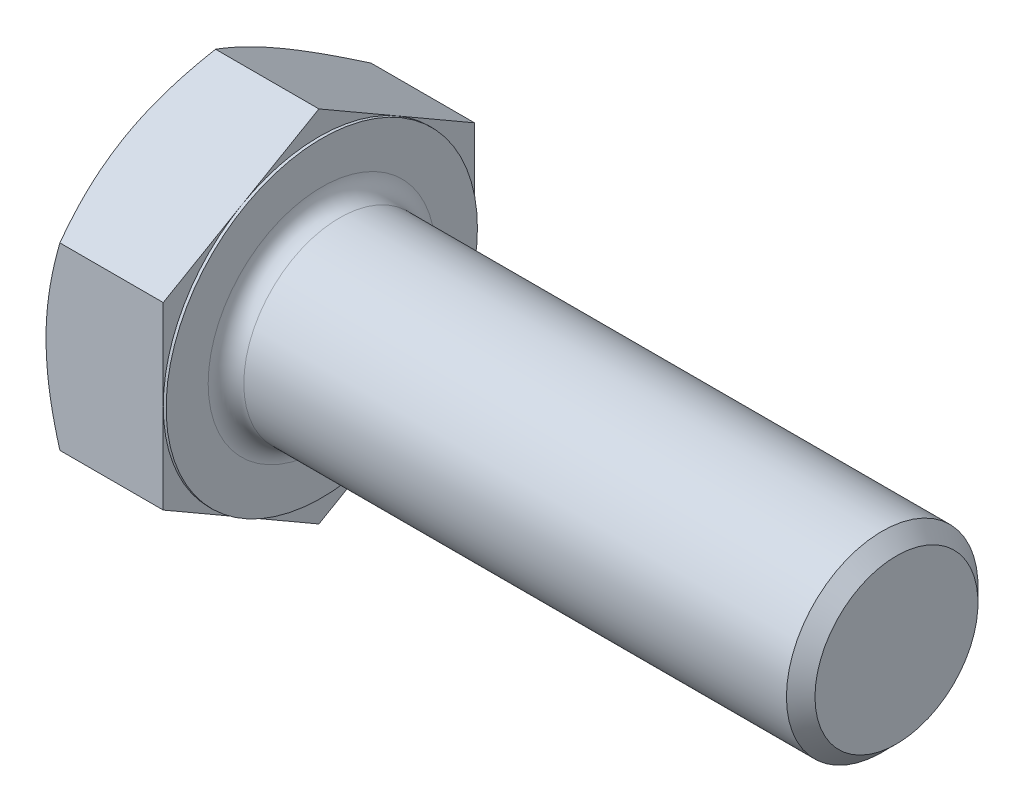
ISO-10303-21;
HEADER;
FILE_DESCRIPTION(('STEP AP214'),'2;1');
FILE_NAME('part.step','',(''),(''),'','','');
FILE_SCHEMA(('AUTOMOTIVE_DESIGN { 1 0 10303 214 1 1 1 1 }'));
ENDSEC;
DATA;
#1=APPLICATION_CONTEXT('core data for automotive mechanical design processes');
#2=APPLICATION_PROTOCOL_DEFINITION('international standard','automotive_design',2000,#1);
#3=PRODUCT_CONTEXT('',#1,'mechanical');
#4=PRODUCT('Part','Part','',(#3));
#5=PRODUCT_RELATED_PRODUCT_CATEGORY('part','',(#4));
#6=PRODUCT_DEFINITION_FORMATION('','',#4);
#7=PRODUCT_DEFINITION_CONTEXT('part definition',#1,'design');
#8=PRODUCT_DEFINITION('design','',#6,#7);
#9=PRODUCT_DEFINITION_SHAPE('','',#8);
#10=(LENGTH_UNIT() NAMED_UNIT(*) SI_UNIT(.MILLI.,.METRE.));
#11=(NAMED_UNIT(*) PLANE_ANGLE_UNIT() SI_UNIT($,.RADIAN.));
#12=(NAMED_UNIT(*) SI_UNIT($,.STERADIAN.) SOLID_ANGLE_UNIT());
#13=UNCERTAINTY_MEASURE_WITH_UNIT(LENGTH_MEASURE(1.E-05),#10,'distance_accuracy_value','');
#14=(GEOMETRIC_REPRESENTATION_CONTEXT(3) GLOBAL_UNCERTAINTY_ASSIGNED_CONTEXT((#13)) GLOBAL_UNIT_ASSIGNED_CONTEXT((#10,
#11,#12)) REPRESENTATION_CONTEXT('',''));
#15=CARTESIAN_POINT('',(0.,0.,0.));
#16=DIRECTION('',(0.,0.,1.));
#17=DIRECTION('',(1.,0.,0.));
#18=AXIS2_PLACEMENT_3D('',#15,#16,#17);
#19=CARTESIAN_POINT('',(15.9258,23.8301323608018,0.));
#20=DIRECTION('',(1.,0.,0.));
#21=DIRECTION('',(0.,0.,-1.));
#22=AXIS2_PLACEMENT_3D('',#19,#20,#21);
#23=PLANE('',#22);
#24=CARTESIAN_POINT('',(15.9258,0.,0.));
#25=DIRECTION('',(1.,0.,0.));
#26=DIRECTION('',(0.,0.,-1.));
#27=AXIS2_PLACEMENT_3D('',#24,#25,#26);
#28=CIRCLE('',#27,15.0622);
#29=CARTESIAN_POINT('',(15.9258,0.,-15.0622));
#30=VERTEX_POINT('',#29);
#31=EDGE_CURVE('E40',#30,#30,#28,.F.);
#32=ORIENTED_EDGE('',*,*,#31,.T.);
#33=EDGE_LOOP('',(#32));
#34=FACE_BOUND('',#33,.T.);
#35=CARTESIAN_POINT('',(15.9258,0.,0.));
#36=DIRECTION('',(1.,0.,0.));
#37=DIRECTION('',(0.,0.,-1.));
#38=AXIS2_PLACEMENT_3D('',#35,#36,#37);
#39=CIRCLE('',#38,20.6375);
#40=CARTESIAN_POINT('',(15.9258,0.,-20.6375));
#41=VERTEX_POINT('',#40);
#42=EDGE_CURVE('E291',#41,#41,#39,.T.);
#43=ORIENTED_EDGE('',*,*,#42,.T.);
#44=EDGE_LOOP('',(#43));
#45=FACE_BOUND('',#44,.T.);
#46=ADVANCED_FACE('F32',(#34,#45),#23,.T.);
#47=CARTESIAN_POINT('',(0.,0.,0.));
#48=DIRECTION('',(-1.,0.,0.));
#49=DIRECTION('',(0.,0.,1.));
#50=AXIS2_PLACEMENT_3D('',#47,#48,#49);
#51=CYLINDRICAL_SURFACE('',#50,12.7);
#52=CARTESIAN_POINT('',(18.288,0.,0.));
#53=DIRECTION('',(1.,0.,0.));
#54=DIRECTION('',(0.,0.,-1.));
#55=AXIS2_PLACEMENT_3D('',#52,#53,#54);
#56=CIRCLE('',#55,12.7);
#57=CARTESIAN_POINT('',(18.288,0.,-12.7));
#58=VERTEX_POINT('',#57);
#59=EDGE_CURVE('E11',#58,#58,#56,.T.);
#60=ORIENTED_EDGE('',*,*,#59,.T.);
#61=EDGE_LOOP('',(#60));
#62=FACE_BOUND('',#61,.T.);
#63=CARTESIAN_POINT('',(90.2335,0.,0.));
#64=DIRECTION('',(-1.,0.,0.));
#65=DIRECTION('',(0.,0.,1.));
#66=AXIS2_PLACEMENT_3D('',#63,#64,#65);
#67=CIRCLE('',#66,12.7);
#68=CARTESIAN_POINT('',(90.2335,0.,12.7));
#69=VERTEX_POINT('',#68);
#70=EDGE_CURVE('E270',#69,#69,#67,.T.);
#71=ORIENTED_EDGE('',*,*,#70,.T.);
#72=EDGE_LOOP('',(#71));
#73=FACE_BOUND('',#72,.T.);
#74=ADVANCED_FACE('F244',(#62,#73),#51,.T.);
#75=CARTESIAN_POINT('',(92.1258,0.,0.));
#76=DIRECTION('',(-1.,0.,0.));
#77=DIRECTION('',(0.,0.,1.));
#78=AXIS2_PLACEMENT_3D('',#75,#76,#77);
#79=CONICAL_SURFACE('',#78,10.8077,0.785398163397441);
#80=ORIENTED_EDGE('',*,*,#70,.F.);
#81=EDGE_LOOP('',(#80));
#82=FACE_BOUND('',#81,.T.);
#83=CARTESIAN_POINT('',(92.1258,0.,0.));
#84=DIRECTION('',(-1.,0.,0.));
#85=DIRECTION('',(0.,0.,1.));
#86=AXIS2_PLACEMENT_3D('',#83,#84,#85);
#87=CIRCLE('',#86,10.8077);
#88=CARTESIAN_POINT('',(92.1258,0.,10.8077));
#89=VERTEX_POINT('',#88);
#90=EDGE_CURVE('E268',#89,#89,#87,.T.);
#91=ORIENTED_EDGE('',*,*,#90,.T.);
#92=EDGE_LOOP('',(#91));
#93=FACE_BOUND('',#92,.T.);
#94=ADVANCED_FACE('F249',(#82,#93),#79,.T.);
#95=CARTESIAN_POINT('',(92.1258,0.,0.));
#96=DIRECTION('',(-1.,0.,0.));
#97=DIRECTION('',(0.,0.,1.));
#98=AXIS2_PLACEMENT_3D('',#95,#96,#97);
#99=PLANE('',#98);
#100=ORIENTED_EDGE('',*,*,#90,.F.);
#101=EDGE_LOOP('',(#100));
#102=FACE_BOUND('',#101,.T.);
#103=ADVANCED_FACE('F256',(#102),#99,.F.);
#104=CARTESIAN_POINT('',(15.5448,20.6375,0.));
#105=DIRECTION('',(1.,0.,0.));
#106=DIRECTION('',(0.,0.,-1.));
#107=AXIS2_PLACEMENT_3D('',#104,#105,#106);
#108=PLANE('',#107);
#109=DIRECTION('',(0.,0.500000000000001,0.866025403784438));
#110=VECTOR('',#109,1.);
#111=CARTESIAN_POINT('',(15.5448,11.9150661804009,-20.6375));
#112=LINE('',#111,#110);
#113=CARTESIAN_POINT('',(15.5448,11.9150661804009,-20.6375));
#114=VERTEX_POINT('',#113);
#115=CARTESIAN_POINT('',(15.5448,17.8725992706013,-10.31875));
#116=VERTEX_POINT('',#115);
#117=EDGE_CURVE('E164',#114,#116,#112,.T.);
#118=ORIENTED_EDGE('',*,*,#117,.T.);
#119=CARTESIAN_POINT('',(15.5448,0.,0.));
#120=DIRECTION('',(-1.,0.,0.));
#121=DIRECTION('',(0.,0.,1.));
#122=AXIS2_PLACEMENT_3D('',#119,#120,#121);
#123=CIRCLE('',#122,20.6375);
#124=CARTESIAN_POINT('',(15.5448,0.,-20.6375));
#125=VERTEX_POINT('',#124);
#126=EDGE_CURVE('E47',#116,#125,#123,.T.);
#127=ORIENTED_EDGE('',*,*,#126,.T.);
#128=DIRECTION('',(0.,1.,0.));
#129=VECTOR('',#128,1.);
#130=CARTESIAN_POINT('',(15.5448,11.9150661804009,-20.6375));
#131=LINE('',#130,#129);
#132=EDGE_CURVE('E294',#125,#114,#131,.T.);
#133=ORIENTED_EDGE('',*,*,#132,.T.);
#134=EDGE_LOOP('',(#118,#127,#133));
#135=FACE_BOUND('',#134,.T.);
#136=ADVANCED_FACE('F259',(#135),#108,.T.);
#137=CARTESIAN_POINT('',(15.5448,23.8301323608018,0.));
#138=VERTEX_POINT('',#137);
#139=EDGE_CURVE('E162',#116,#138,#112,.T.);
#140=ORIENTED_EDGE('',*,*,#139,.T.);
#141=DIRECTION('',(0.,-0.500000000000001,0.866025403784438));
#142=VECTOR('',#141,1.);
#143=CARTESIAN_POINT('',(15.5448,23.8301323608018,0.));
#144=LINE('',#143,#142);
#145=CARTESIAN_POINT('',(15.5448,17.8725992706013,10.31875));
#146=VERTEX_POINT('',#145);
#147=EDGE_CURVE('E161',#138,#146,#144,.T.);
#148=ORIENTED_EDGE('',*,*,#147,.T.);
#149=EDGE_CURVE('E150',#146,#116,#123,.T.);
#150=ORIENTED_EDGE('',*,*,#149,.T.);
#151=EDGE_LOOP('',(#140,#148,#150));
#152=FACE_BOUND('',#151,.T.);
#153=ADVANCED_FACE('F264',(#152),#108,.T.);
#154=CARTESIAN_POINT('',(15.5448,11.9150661804009,20.6375));
#155=VERTEX_POINT('',#154);
#156=EDGE_CURVE('E129',#146,#155,#144,.T.);
#157=ORIENTED_EDGE('',*,*,#156,.T.);
#158=DIRECTION('',(0.,-1.,0.));
#159=VECTOR('',#158,1.);
#160=CARTESIAN_POINT('',(15.5448,11.9150661804009,20.6375));
#161=LINE('',#160,#159);
#162=CARTESIAN_POINT('',(15.5448,0.,20.6375));
#163=VERTEX_POINT('',#162);
#164=EDGE_CURVE('E123',#155,#163,#161,.T.);
#165=ORIENTED_EDGE('',*,*,#164,.T.);
#166=EDGE_CURVE('E127',#163,#146,#123,.T.);
#167=ORIENTED_EDGE('',*,*,#166,.T.);
#168=EDGE_LOOP('',(#157,#165,#167));
#169=FACE_BOUND('',#168,.T.);
#170=ADVANCED_FACE('F125',(#169),#108,.T.);
#171=CARTESIAN_POINT('',(15.5448,-11.9150661804008,20.6375));
#172=VERTEX_POINT('',#171);
#173=EDGE_CURVE('E133',#163,#172,#161,.T.);
#174=ORIENTED_EDGE('',*,*,#173,.T.);
#175=DIRECTION('',(0.,-0.500000000000002,-0.866025403784438));
#176=VECTOR('',#175,1.);
#177=CARTESIAN_POINT('',(15.5448,-23.8301323608018,0.));
#178=LINE('',#177,#176);
#179=CARTESIAN_POINT('',(15.5448,-17.8725992706013,10.31875));
#180=VERTEX_POINT('',#179);
#181=EDGE_CURVE('E140',#172,#180,#178,.T.);
#182=ORIENTED_EDGE('',*,*,#181,.T.);
#183=EDGE_CURVE('E137',#180,#163,#123,.T.);
#184=ORIENTED_EDGE('',*,*,#183,.T.);
#185=EDGE_LOOP('',(#174,#182,#184));
#186=FACE_BOUND('',#185,.T.);
#187=ADVANCED_FACE('F138',(#186),#108,.T.);
#188=CARTESIAN_POINT('',(15.5448,-23.8301323608018,0.));
#189=VERTEX_POINT('',#188);
#190=EDGE_CURVE('E156',#180,#189,#178,.T.);
#191=ORIENTED_EDGE('',*,*,#190,.T.);
#192=DIRECTION('',(0.,0.499999999999999,-0.866025403784439));
#193=VECTOR('',#192,1.);
#194=CARTESIAN_POINT('',(15.5448,-11.9150661804009,-20.6375));
#195=LINE('',#194,#193);
#196=CARTESIAN_POINT('',(15.5448,-17.8725992706014,-10.31875));
#197=VERTEX_POINT('',#196);
#198=EDGE_CURVE('E332',#189,#197,#195,.T.);
#199=ORIENTED_EDGE('',*,*,#198,.T.);
#200=EDGE_CURVE('E144',#197,#180,#123,.T.);
#201=ORIENTED_EDGE('',*,*,#200,.T.);
#202=EDGE_LOOP('',(#191,#199,#201));
#203=FACE_BOUND('',#202,.T.);
#204=ADVANCED_FACE('F333',(#203),#108,.T.);
#205=CARTESIAN_POINT('',(15.5448,-11.9150661804009,-20.6375));
#206=VERTEX_POINT('',#205);
#207=EDGE_CURVE('E151',#197,#206,#195,.T.);
#208=ORIENTED_EDGE('',*,*,#207,.T.);
#209=EDGE_CURVE('E295',#206,#125,#131,.T.);
#210=ORIENTED_EDGE('',*,*,#209,.T.);
#211=EDGE_CURVE('E302',#125,#197,#123,.T.);
#212=ORIENTED_EDGE('',*,*,#211,.T.);
#213=EDGE_LOOP('',(#208,#210,#212));
#214=FACE_BOUND('',#213,.T.);
#215=ADVANCED_FACE('F265',(#214),#108,.T.);
#216=CARTESIAN_POINT('',(0.,0.,0.));
#217=DIRECTION('',(-1.,0.,0.));
#218=DIRECTION('',(0.,0.,1.));
#219=AXIS2_PLACEMENT_3D('',#216,#217,#218);
#220=CYLINDRICAL_SURFACE('',#219,20.6375);
#221=ORIENTED_EDGE('',*,*,#126,.F.);
#222=ORIENTED_EDGE('',*,*,#149,.F.);
#223=ORIENTED_EDGE('',*,*,#166,.F.);
#224=ORIENTED_EDGE('',*,*,#183,.F.);
#225=ORIENTED_EDGE('',*,*,#200,.F.);
#226=ORIENTED_EDGE('',*,*,#211,.F.);
#227=EDGE_LOOP('',(#221,#222,#223,#224,#225,#226));
#228=FACE_BOUND('',#227,.T.);
#229=ORIENTED_EDGE('',*,*,#42,.F.);
#230=EDGE_LOOP('',(#229));
#231=FACE_BOUND('',#230,.T.);
#232=ADVANCED_FACE('F147',(#228,#231),#220,.T.);
#233=CARTESIAN_POINT('',(0.,23.8301323608018,0.));
#234=DIRECTION('',(1.,0.,0.));
#235=DIRECTION('',(0.,0.,-1.));
#236=AXIS2_PLACEMENT_3D('',#233,#234,#235);
#237=PLANE('',#236);
#238=CARTESIAN_POINT('',(0.,0.,0.));
#239=DIRECTION('',(1.,0.,0.));
#240=DIRECTION('',(0.,0.,-1.));
#241=AXIS2_PLACEMENT_3D('',#238,#239,#240);
#242=CIRCLE('',#241,20.6375);
#243=CARTESIAN_POINT('',(0.,0.,-20.6375));
#244=VERTEX_POINT('',#243);
#245=CARTESIAN_POINT('',(0.,17.8725992706013,-10.31875));
#246=VERTEX_POINT('',#245);
#247=EDGE_CURVE('E290',#244,#246,#242,.T.);
#248=ORIENTED_EDGE('',*,*,#247,.F.);
#249=CARTESIAN_POINT('',(0.,-17.8725992706014,-10.31875));
#250=VERTEX_POINT('',#249);
#251=EDGE_CURVE('E286',#250,#244,#242,.T.);
#252=ORIENTED_EDGE('',*,*,#251,.F.);
#253=CARTESIAN_POINT('',(0.,-17.8725992706013,10.31875));
#254=VERTEX_POINT('',#253);
#255=EDGE_CURVE('E289',#254,#250,#242,.T.);
#256=ORIENTED_EDGE('',*,*,#255,.F.);
#257=CARTESIAN_POINT('',(0.,0.,20.6375));
#258=VERTEX_POINT('',#257);
#259=EDGE_CURVE('E325',#258,#254,#242,.T.);
#260=ORIENTED_EDGE('',*,*,#259,.F.);
#261=CARTESIAN_POINT('',(0.,0.,0.));
#262=DIRECTION('',(-1.,0.,0.));
#263=DIRECTION('',(0.,0.,1.));
#264=AXIS2_PLACEMENT_3D('',#261,#262,#263);
#265=CIRCLE('',#264,20.6375);
#266=CARTESIAN_POINT('',(0.,17.8725992706013,10.31875));
#267=VERTEX_POINT('',#266);
#268=EDGE_CURVE('E165',#258,#267,#265,.T.);
#269=ORIENTED_EDGE('',*,*,#268,.T.);
#270=EDGE_CURVE('E348',#246,#267,#242,.T.);
#271=ORIENTED_EDGE('',*,*,#270,.F.);
#272=EDGE_LOOP('',(#248,#252,#256,#260,#269,#271));
#273=FACE_BOUND('',#272,.T.);
#274=ADVANCED_FACE('F194',(#273),#237,.F.);
#275=CARTESIAN_POINT('',(0.,0.,0.));
#276=DIRECTION('',(1.,0.,0.));
#277=DIRECTION('',(0.,0.,-1.));
#278=AXIS2_PLACEMENT_3D('',#275,#276,#277);
#279=CONICAL_SURFACE('',#278,20.6375,1.0471975511966);
#280=CARTESIAN_POINT('',(1.84333382008364,11.914950710347,20.6377));
#281=CARTESIAN_POINT('',(1.69214337600419,12.1768388162799,20.1840964946264));
#282=CARTESIAN_POINT('',(1.54781374226857,12.4397484262674,19.7287236923298));
#283=CARTESIAN_POINT('',(1.27478315292442,12.9676758674181,18.814326541547));
#284=CARTESIAN_POINT('',(1.14608733754576,13.2326943616077,18.3553010446653));
#285=CARTESIAN_POINT('',(0.906054325478838,13.7653517625208,17.4327113632561));
#286=CARTESIAN_POINT('',(0.794758200785631,14.0329953304674,16.9691391052536));
#287=CARTESIAN_POINT('',(0.591914465835048,14.5701421920253,16.0387734499091));
#288=CARTESIAN_POINT('',(0.50036572457894,14.8396453782173,15.571980238623));
#289=CARTESIAN_POINT('',(0.340910585633043,15.3736059110997,14.6471334664341));
#290=CARTESIAN_POINT('',(0.272476417896142,15.6380236169871,14.1891485654163));
#291=CARTESIAN_POINT('',(0.157727822186074,16.1680706173259,13.27108023043));
#292=CARTESIAN_POINT('',(0.111413819990831,16.4336999349996,12.8109967562394));
#293=CARTESIAN_POINT('',(0.0420749613202055,16.9654047822575,11.890056946158));
#294=CARTESIAN_POINT('',(0.0190224305713767,17.2314794034924,11.4292021835745));
#295=CARTESIAN_POINT('',(-0.00329774541931306,17.7638741917795,10.5070673605763));
#296=CARTESIAN_POINT('',(-0.00256612562751956,18.03019435099,10.045787313744));
#297=CARTESIAN_POINT('',(0.0210208772954903,18.528085064253,9.18341530175577));
#298=CARTESIAN_POINT('',(0.0410000333968362,18.759691076882,8.78226192054387));
#299=CARTESIAN_POINT('',(0.0985671327331307,19.2223501741672,7.98091285746198));
#300=CARTESIAN_POINT('',(0.136154823768635,19.4534032666949,7.58071716195798));
#301=CARTESIAN_POINT('',(0.228287552877122,19.9148711564043,6.78143133091973));
#302=CARTESIAN_POINT('',(0.282847925177507,20.1452851855258,6.38234252570475));
#303=CARTESIAN_POINT('',(0.407960382025439,20.605009976384,5.58607583043941));
#304=CARTESIAN_POINT('',(0.478512398814658,20.8343207427911,5.18889793229961));
#305=CARTESIAN_POINT('',(0.71596653239891,21.530459444307,3.98315033215904));
#306=CARTESIAN_POINT('',(0.906558493433515,21.9953095159287,3.17800639020824));
#307=CARTESIAN_POINT('',(1.23103244120646,22.6874510236457,1.97918213281513));
#308=CARTESIAN_POINT('',(1.34550466252447,22.9171109250422,1.58139951513513));
#309=CARTESIAN_POINT('',(1.58603801996833,23.3748421953101,0.788585698818164));
#310=CARTESIAN_POINT('',(1.71209588971682,23.6029139925318,0.393553758256622));
#311=CARTESIAN_POINT('',(1.84333382008365,23.8302478308557,-0.000200000000002177));
#312=B_SPLINE_CURVE_WITH_KNOTS('',3,(#280,#281,#282,#283,#284,#285,#286,#287,#288,#289,#290,
#291,#292,#293,#294,#295,#296,#297,#298,#299,#300,#301,#302,#303,#304,#305,#306,#307,#308,#309,
#310,#311),.UNSPECIFIED.,.F.,.F.,(4,2,2,2,2,2,2,2,2,2,2,2,2,2,2,4),(0.,1.63552456713319,
3.27158542986609,4.91145173081582,6.55122408618254,8.1505234671481,9.74985363083664,
11.3472788131478,12.9446546326435,14.3352468669901,15.7258191850933,17.1176515036881,
18.5094779250488,21.3544387799186,22.7744411084872,24.1940443124036),.UNSPECIFIED.);
#313=CARTESIAN_POINT('',(1.84326715293243,23.8301323608018,0.));
#314=VERTEX_POINT('',#313);
#315=EDGE_CURVE('E213',#267,#314,#312,.T.);
#316=ORIENTED_EDGE('',*,*,#315,.T.);
#317=CARTESIAN_POINT('',(1.84333382008365,23.8302478308557,0.0002));
#318=CARTESIAN_POINT('',(1.69214337600421,23.5683597249228,-0.453403505373618));
#319=CARTESIAN_POINT('',(1.54781374226858,23.3054501149353,-0.908776307670228));
#320=CARTESIAN_POINT('',(1.27478315292444,22.7775226737846,-1.82317345845298));
#321=CARTESIAN_POINT('',(1.14608733754577,22.512504179595,-2.28219895533469));
#322=CARTESIAN_POINT('',(0.906054325478847,21.9798467786819,-3.20478863674389));
#323=CARTESIAN_POINT('',(0.79475820078564,21.7122032107353,-3.66836089474639));
#324=CARTESIAN_POINT('',(0.591914465835055,21.1750563491774,-4.59872655009088));
#325=CARTESIAN_POINT('',(0.500365724578947,20.9055531629854,-5.06551976137699));
#326=CARTESIAN_POINT('',(0.340910585633049,20.371592630103,-5.99036653356587));
#327=CARTESIAN_POINT('',(0.272476417896147,20.1071749242156,-6.44835143458366));
#328=CARTESIAN_POINT('',(0.157727822186078,19.5771279238768,-7.36641976956998));
#329=CARTESIAN_POINT('',(0.111413819990834,19.3114986062031,-7.82650324376062));
#330=CARTESIAN_POINT('',(0.0420749613202066,18.7797937589452,-8.74744305384203));
#331=CARTESIAN_POINT('',(0.019022430571377,18.5137191377103,-9.2082978164255));
#332=CARTESIAN_POINT('',(-0.00329774541931427,17.9813243494232,-10.1304326394237));
#333=CARTESIAN_POINT('',(-0.00256612562752133,17.7150041902127,-10.591712686256));
#334=CARTESIAN_POINT('',(0.0210208772954871,17.2171134769497,-11.4540846982442));
#335=CARTESIAN_POINT('',(0.0410000333968321,16.9855074643207,-11.8552380794561));
#336=CARTESIAN_POINT('',(0.0985671327331258,16.5228483670355,-12.656587142538));
#337=CARTESIAN_POINT('',(0.136154823768631,16.2917952745077,-13.056782838042));
#338=CARTESIAN_POINT('',(0.228287552877117,15.8303273847984,-13.8560686690803));
#339=CARTESIAN_POINT('',(0.282847925177502,15.5999133556769,-14.2551574742953));
#340=CARTESIAN_POINT('',(0.407960382025433,15.1401885648187,-15.0514241695606));
#341=CARTESIAN_POINT('',(0.478512398814649,14.9108777984116,-15.4486020677004));
#342=CARTESIAN_POINT('',(0.715966532398898,14.2147390968957,-16.654349667841));
#343=CARTESIAN_POINT('',(0.906558493433504,13.749889025274,-17.4594936097918));
#344=CARTESIAN_POINT('',(1.23103244120645,13.057747517557,-18.6583178671849));
#345=CARTESIAN_POINT('',(1.34550466252446,12.8280876161605,-19.0561004848649));
#346=CARTESIAN_POINT('',(1.58603801996831,12.3703563458926,-19.8489143011818));
#347=CARTESIAN_POINT('',(1.7120958897168,12.1422845486709,-20.2439462417434));
#348=CARTESIAN_POINT('',(1.84333382008363,11.914950710347,-20.6377));
#349=B_SPLINE_CURVE_WITH_KNOTS('',3,(#317,#318,#319,#320,#321,#322,#323,#324,#325,#326,#327,
#328,#329,#330,#331,#332,#333,#334,#335,#336,#337,#338,#339,#340,#341,#342,#343,#344,#345,#346,
#347,#348),.UNSPECIFIED.,.F.,.F.,(4,2,2,2,2,2,2,2,2,2,2,2,2,2,2,4),(0.,1.63552456713319,
3.27158542986609,4.91145173081583,6.55122408618254,8.1505234671481,9.74985363083665,
11.3472788131478,12.9446546326435,14.3352468669901,15.7258191850933,17.1176515036881,
18.5094779250488,21.3544387799186,22.7744411084872,24.1940443124036),.UNSPECIFIED.);
#350=EDGE_CURVE('E55',#314,#246,#349,.T.);
#351=ORIENTED_EDGE('',*,*,#350,.T.);
#352=ORIENTED_EDGE('',*,*,#270,.T.);
#353=EDGE_LOOP('',(#316,#351,#352));
#354=FACE_BOUND('',#353,.T.);
#355=ADVANCED_FACE('F349',(#354),#279,.T.);
#356=CARTESIAN_POINT('',(10.1233678679264,-32.1118563720228,20.6375));
#357=CARTESIAN_POINT('',(9.90427008759402,-31.6607456968352,20.6375));
#358=CARTESIAN_POINT('',(9.68625680449786,-31.2091085460888,20.6375));
#359=CARTESIAN_POINT('',(9.25264463441763,-30.3046714669,20.6375));
#360=CARTESIAN_POINT('',(9.03704577139592,-29.851871526972,20.6375));
#361=CARTESIAN_POINT('',(8.39418278845544,-28.4914436913444,20.6375));
#362=CARTESIAN_POINT('',(7.97091645494712,-27.5819195637715,20.6375));
#363=CARTESIAN_POINT('',(7.13532758177969,-25.7519215328191,20.6375));
#364=CARTESIAN_POINT('',(6.72307624643973,-24.8314150396297,20.6375));
#365=CARTESIAN_POINT('',(5.91529515061251,-22.9831190900477,20.6375));
#366=CARTESIAN_POINT('',(5.51976460735619,-22.0553299770008,20.6375));
#367=CARTESIAN_POINT('',(4.73729219130504,-20.1605940697453,20.6375));
#368=CARTESIAN_POINT('',(4.35105046715439,-19.1933566306423,20.6375));
#369=CARTESIAN_POINT('',(3.60754060681879,-17.2475981851876,20.6375));
#370=CARTESIAN_POINT('',(3.25027570769021,-16.2690759320958,20.6375));
#371=CARTESIAN_POINT('',(2.57402614646954,-14.3010202867253,20.6375));
#372=CARTESIAN_POINT('',(2.25496489526019,-13.3115134229623,20.6375));
#373=CARTESIAN_POINT('',(1.66527212357813,-11.318212065929,20.6375));
#374=CARTESIAN_POINT('',(1.39462546080807,-10.3144221462795,20.6375));
#375=CARTESIAN_POINT('',(1.03545163612044,-8.80063418686218,20.6375));
#376=CARTESIAN_POINT('',(0.923771740021875,-8.29609693722225,20.6375));
#377=CARTESIAN_POINT('',(0.717329256271048,-7.28355521535114,20.6375));
#378=CARTESIAN_POINT('',(0.622566326003781,-6.77555081355569,20.6375));
#379=CARTESIAN_POINT('',(0.451625499398932,-5.75642686434093,20.6375));
#380=CARTESIAN_POINT('',(0.375446963091418,-5.24530742481211,20.6375));
#381=CARTESIAN_POINT('',(0.243185628597375,-4.22045710355663,20.6375));
#382=CARTESIAN_POINT('',(0.187102816380386,-3.70672622365347,20.6375));
#383=CARTESIAN_POINT('',(0.0968611486188547,-2.68415366617242,20.6375));
#384=CARTESIAN_POINT('',(0.0624231051427364,-2.17533677867888,20.6375));
#385=CARTESIAN_POINT('',(0.0151010187593515,-1.15670325298086,20.6375));
#386=CARTESIAN_POINT('',(0.00221661537602976,-0.646886631639317,20.6375));
#387=CARTESIAN_POINT('',(-0.00169134733722277,0.372835415780186,20.6375));
#388=CARTESIAN_POINT('',(0.0072851629896587,0.882740842135931,20.6375));
#389=CARTESIAN_POINT('',(0.0468787652522877,1.9017164984125,20.6375));
#390=CARTESIAN_POINT('',(0.0774968264110684,2.41078668990359,20.6375));
#391=CARTESIAN_POINT('',(0.17617491370146,3.63103902741007,20.6375));
#392=CARTESIAN_POINT('',(0.254325083050728,4.34141978583087,20.6375));
#393=CARTESIAN_POINT('',(0.448536450463003,5.75698322687912,20.6375));
#394=CARTESIAN_POINT('',(0.56460271519729,6.46216520191579,20.6375));
#395=CARTESIAN_POINT('',(0.830517562096812,7.86663403680342,20.6375));
#396=CARTESIAN_POINT('',(0.980392199432029,8.56591591612025,20.6375));
#397=CARTESIAN_POINT('',(1.30934404041187,9.95750121301223,20.6375));
#398=CARTESIAN_POINT('',(1.48842082542165,10.6498047304764,20.6375));
#399=CARTESIAN_POINT('',(1.8756560837149,12.0426964917778,20.6375));
#400=CARTESIAN_POINT('',(2.08437031813341,12.7431291527127,20.6375));
#401=CARTESIAN_POINT('',(2.52357115148503,14.1370960055512,20.6375));
#402=CARTESIAN_POINT('',(2.75405789458341,14.8306301517432,20.6375));
#403=CARTESIAN_POINT('',(3.2331260037703,16.2111388331317,20.6375));
#404=CARTESIAN_POINT('',(3.48170148429213,16.8981154204069,20.6375));
#405=CARTESIAN_POINT('',(3.99400235115313,18.2663626057979,20.6375));
#406=CARTESIAN_POINT('',(4.25772755691505,18.9476332718146,20.6375));
#407=CARTESIAN_POINT('',(4.8988376291131,20.5590145924699,20.6375));
#408=CARTESIAN_POINT('',(5.28183896278094,21.4868873243947,20.6375));
#409=CARTESIAN_POINT('',(6.06661514119217,23.3346835086338,20.6375));
#410=CARTESIAN_POINT('',(6.46839117294355,24.2546064539635,20.6375));
#411=CARTESIAN_POINT('',(7.28694571952704,26.0879885520055,20.6375));
#412=CARTESIAN_POINT('',(7.703727656904,27.0014461725291,20.6375));
#413=CARTESIAN_POINT('',(8.54925608225559,28.8227686796051,20.6375));
#414=CARTESIAN_POINT('',(8.97800230775764,29.7306336883158,20.6375));
#415=CARTESIAN_POINT('',(9.84569867699957,31.5427118405265,20.6375));
#416=CARTESIAN_POINT('',(10.2846596750131,32.4469197774181,20.6375));
#417=CARTESIAN_POINT('',(11.1705735350971,34.2514113836615,20.6375));
#418=CARTESIAN_POINT('',(11.6175264324881,35.1516950356479,20.6375));
#419=CARTESIAN_POINT('',(12.517991568785,36.9488265919903,20.6375));
#420=CARTESIAN_POINT('',(12.9715029503701,37.845674926365,20.6375));
#421=CARTESIAN_POINT('',(13.8840629457393,39.6365449590598,20.6375));
#422=CARTESIAN_POINT('',(14.3431115489658,40.5305666627652,20.6375));
#423=CARTESIAN_POINT('',(15.6493121814541,43.0582372659198,20.6375));
#424=CARTESIAN_POINT('',(16.5019361837319,44.6890583952701,20.6375));
#425=CARTESIAN_POINT('',(18.218831753076,47.944618806486,20.6375));
#426=CARTESIAN_POINT('',(19.0831037421609,49.5693578652521,20.6375));
#427=CARTESIAN_POINT('',(20.8183569713892,52.8099478810823,20.6375));
#428=CARTESIAN_POINT('',(21.6893156480565,54.4258109286343,20.6375));
#429=CARTESIAN_POINT('',(23.000931669619,56.8467384393976,20.6375));
#430=CARTESIAN_POINT('',(23.4389878760915,57.6532142624228,20.6375));
#431=CARTESIAN_POINT('',(24.3166534691618,59.2653187692752,20.6375));
#432=CARTESIAN_POINT('',(24.7562628533391,60.07094745442,20.6375));
#433=CARTESIAN_POINT('',(25.1965591804146,60.8762006412571,20.6375));
#434=B_SPLINE_CURVE_WITH_KNOTS('',3,(#356,#357,#358,#359,#360,#361,#362,#363,#364,#365,#366,
#367,#368,#369,#370,#371,#372,#373,#374,#375,#376,#377,#378,#379,#380,#381,#382,#383,#384,#385,
#386,#387,#388,#389,#390,#391,#392,#393,#394,#395,#396,#397,#398,#399,#400,#401,#402,#403,#404,
#405,#406,#407,#408,#409,#410,#411,#412,#413,#414,#415,#416,#417,#418,#419,#420,#421,#422,#423,
#424,#425,#426,#427,#428,#429,#430,#431,#432,#433),.UNSPECIFIED.,.F.,.F.,(4,2,2,2,2,2,2,2,2,2,2,
2,2,2,2,2,2,2,2,2,2,2,2,2,2,2,2,2,2,2,2,2,2,2,2,2,2,2,4),(0.,1.5045045719864,3.00902406249654,
6.01850276336142,9.04418712204813,12.0697296787894,15.1938876671237,18.3183941817793,
21.4365280414981,24.5536849523303,26.1036962789161,27.6536762099544,29.2036027585358,
30.7535282249853,32.2830277613178,33.8125017171234,35.341980546395,36.8715278781531,
39.0143441873397,41.1574469550834,43.302207029525,45.4469363599133,47.6391167792206,
49.8313117149286,52.0227965340944,54.2142552372602,57.2254091003985,60.2367535984225,
63.2487893293878,66.2607590341771,69.2760903204203,72.2914349363065,75.3063888886273,
78.3213370934272,83.8420362799441,89.362936027719,94.8698395387971,97.6231396494828,
100.376435471273),.UNSPECIFIED.);
#435=CARTESIAN_POINT('',(1.84326715293242,11.9150661804009,20.6375));
#436=VERTEX_POINT('',#435);
#437=EDGE_CURVE('E225',#258,#436,#434,.T.);
#438=ORIENTED_EDGE('',*,*,#437,.T.);
#439=EDGE_CURVE('E224',#436,#267,#312,.T.);
#440=ORIENTED_EDGE('',*,*,#439,.T.);
#441=ORIENTED_EDGE('',*,*,#268,.F.);
#442=EDGE_LOOP('',(#438,#440,#441));
#443=FACE_BOUND('',#442,.T.);
#444=ADVANCED_FACE('F319',(#443),#279,.T.);
#445=CARTESIAN_POINT('',(1.84326715293241,-11.9150661804008,20.6375));
#446=VERTEX_POINT('',#445);
#447=EDGE_CURVE('E271',#446,#258,#434,.T.);
#448=ORIENTED_EDGE('',*,*,#447,.T.);
#449=ORIENTED_EDGE('',*,*,#259,.T.);
#450=CARTESIAN_POINT('',(1.84333382008364,-23.8302478308556,-0.000200000000000067));
#451=CARTESIAN_POINT('',(1.6921433760042,-23.5683597249228,0.453403505373616));
#452=CARTESIAN_POINT('',(1.54781374226857,-23.3054501149352,0.908776307670226));
#453=CARTESIAN_POINT('',(1.27478315292443,-22.7775226737846,1.82317345845298));
#454=CARTESIAN_POINT('',(1.14608733754576,-22.512504179595,2.28219895533469));
#455=CARTESIAN_POINT('',(0.90605432547884,-21.9798467786819,3.20478863674388));
#456=CARTESIAN_POINT('',(0.794758200785632,-21.7122032107353,3.66836089474639));
#457=CARTESIAN_POINT('',(0.591914465835048,-21.1750563491773,4.59872655009088));
#458=CARTESIAN_POINT('',(0.50036572457894,-20.9055531629854,5.06551976137698));
#459=CARTESIAN_POINT('',(0.340910585633042,-20.371592630103,5.99036653356587));
#460=CARTESIAN_POINT('',(0.27247641789614,-20.1071749242156,6.44835143458365));
#461=CARTESIAN_POINT('',(0.15772782218607,-19.5771279238768,7.36641976956997));
#462=CARTESIAN_POINT('',(0.111413819990826,-19.3114986062031,7.82650324376061));
#463=CARTESIAN_POINT('',(0.0420749613201979,-18.7797937589452,8.74744305384202));
#464=CARTESIAN_POINT('',(0.0190224305713678,-18.5137191377103,9.20829781642549));
#465=CARTESIAN_POINT('',(-0.0032977454193242,-17.9813243494232,10.1304326394237));
#466=CARTESIAN_POINT('',(-0.0025661256275316,-17.7150041902127,10.591712686256));
#467=CARTESIAN_POINT('',(0.0210208772954764,-17.2171134769497,11.4540846982442));
#468=CARTESIAN_POINT('',(0.0410000333968212,-16.9855074643207,11.8552380794561));
#469=CARTESIAN_POINT('',(0.0985671327331147,-16.5228483670355,12.656587142538));
#470=CARTESIAN_POINT('',(0.136154823768619,-16.2917952745077,13.056782838042));
#471=CARTESIAN_POINT('',(0.228287552877106,-15.8303273847983,13.8560686690803));
#472=CARTESIAN_POINT('',(0.28284792517749,-15.5999133556769,14.2551574742953));
#473=CARTESIAN_POINT('',(0.407960382025421,-15.1401885648187,15.0514241695606));
#474=CARTESIAN_POINT('',(0.478512398814638,-14.9108777984115,15.4486020677004));
#475=CARTESIAN_POINT('',(0.715966532398886,-14.2147390968956,16.654349667841));
#476=CARTESIAN_POINT('',(0.90655849343349,-13.7498890252739,17.4594936097918));
#477=CARTESIAN_POINT('',(1.23103244120644,-13.057747517557,18.6583178671849));
#478=CARTESIAN_POINT('',(1.34550466252445,-12.8280876161605,19.0561004848649));
#479=CARTESIAN_POINT('',(1.58603801996831,-12.3703563458926,19.8489143011818));
#480=CARTESIAN_POINT('',(1.7120958897168,-12.1422845486709,20.2439462417434));
#481=CARTESIAN_POINT('',(1.84333382008362,-11.914950710347,20.6377));
#482=B_SPLINE_CURVE_WITH_KNOTS('',3,(#450,#451,#452,#453,#454,#455,#456,#457,#458,#459,#460,
#461,#462,#463,#464,#465,#466,#467,#468,#469,#470,#471,#472,#473,#474,#475,#476,#477,#478,#479,
#480,#481),.UNSPECIFIED.,.F.,.F.,(4,2,2,2,2,2,2,2,2,2,2,2,2,2,2,4),(0.,1.63552456713319,
3.27158542986609,4.91145173081583,6.55122408618254,8.1505234671481,9.74985363083665,
11.3472788131478,12.9446546326435,14.3352468669901,15.7258191850933,17.1176515036881,
18.5094779250488,21.3544387799186,22.7744411084873,24.1940443124036),.UNSPECIFIED.);
#483=EDGE_CURVE('E215',#254,#446,#482,.T.);
#484=ORIENTED_EDGE('',*,*,#483,.T.);
#485=EDGE_LOOP('',(#448,#449,#484));
#486=FACE_BOUND('',#485,.T.);
#487=ADVANCED_FACE('F183',(#486),#279,.T.);
#488=CARTESIAN_POINT('',(1.84326715293242,-23.8301323608018,0.));
#489=VERTEX_POINT('',#488);
#490=EDGE_CURVE('E208',#489,#254,#482,.T.);
#491=ORIENTED_EDGE('',*,*,#490,.T.);
#492=ORIENTED_EDGE('',*,*,#255,.T.);
#493=CARTESIAN_POINT('',(1.84333382008365,-11.9149507103471,-20.6377));
#494=CARTESIAN_POINT('',(1.69214337600421,-12.1768388162799,-20.1840964946264));
#495=CARTESIAN_POINT('',(1.54781374226858,-12.4397484262675,-19.7287236923298));
#496=CARTESIAN_POINT('',(1.27478315292444,-12.9676758674181,-18.814326541547));
#497=CARTESIAN_POINT('',(1.14608733754577,-13.2326943616077,-18.3553010446653));
#498=CARTESIAN_POINT('',(0.90605432547885,-13.7653517625209,-17.4327113632561));
#499=CARTESIAN_POINT('',(0.794758200785644,-14.0329953304674,-16.9691391052536));
#500=CARTESIAN_POINT('',(0.59191446583506,-14.5701421920254,-16.0387734499091));
#501=CARTESIAN_POINT('',(0.500365724578951,-14.8396453782173,-15.571980238623));
#502=CARTESIAN_POINT('',(0.340910585633052,-15.3736059110997,-14.6471334664341));
#503=CARTESIAN_POINT('',(0.272476417896151,-15.6380236169871,-14.1891485654163));
#504=CARTESIAN_POINT('',(0.157727822186084,-16.1680706173259,-13.27108023043));
#505=CARTESIAN_POINT('',(0.111413819990842,-16.4336999349996,-12.8109967562394));
#506=CARTESIAN_POINT('',(0.0420749613202162,-16.9654047822575,-11.890056946158));
#507=CARTESIAN_POINT('',(0.019022430571386,-17.2314794034924,-11.4292021835745));
#508=CARTESIAN_POINT('',(-0.00329774541930533,-17.7638741917796,-10.5070673605763));
#509=CARTESIAN_POINT('',(-0.00256612562751193,-18.03019435099,-10.045787313744));
#510=CARTESIAN_POINT('',(0.0210208772954967,-18.528085064253,-9.18341530175576));
#511=CARTESIAN_POINT('',(0.0410000333968414,-18.759691076882,-8.78226192054386));
#512=CARTESIAN_POINT('',(0.0985671327331357,-19.2223501741672,-7.98091285746197));
#513=CARTESIAN_POINT('',(0.136154823768641,-19.453403266695,-7.58071716195797));
#514=CARTESIAN_POINT('',(0.228287552877129,-19.9148711564044,-6.78143133091972));
#515=CARTESIAN_POINT('',(0.282847925177514,-20.1452851855258,-6.38234252570474));
#516=CARTESIAN_POINT('',(0.407960382025445,-20.605009976384,-5.5860758304394));
#517=CARTESIAN_POINT('',(0.478512398814661,-20.8343207427911,-5.1888979322996));
#518=CARTESIAN_POINT('',(0.71596653239891,-21.530459444307,-3.98315033215903));
#519=CARTESIAN_POINT('',(0.906558493433516,-21.9953095159287,-3.17800639020823));
#520=CARTESIAN_POINT('',(1.23103244120646,-22.6874510236457,-1.97918213281512));
#521=CARTESIAN_POINT('',(1.34550466252447,-22.9171109250422,-1.58139951513513));
#522=CARTESIAN_POINT('',(1.58603801996832,-23.3748421953101,-0.788585698818161));
#523=CARTESIAN_POINT('',(1.71209588971681,-23.6029139925318,-0.393553758256621));
#524=CARTESIAN_POINT('',(1.84333382008364,-23.8302478308556,0.000200000000001641));
#525=B_SPLINE_CURVE_WITH_KNOTS('',3,(#493,#494,#495,#496,#497,#498,#499,#500,#501,#502,#503,
#504,#505,#506,#507,#508,#509,#510,#511,#512,#513,#514,#515,#516,#517,#518,#519,#520,#521,#522,
#523,#524),.UNSPECIFIED.,.F.,.F.,(4,2,2,2,2,2,2,2,2,2,2,2,2,2,2,4),(0.,1.63552456713319,
3.27158542986609,4.91145173081582,6.55122408618254,8.15052346714811,9.74985363083665,
11.3472788131478,12.9446546326435,14.3352468669901,15.7258191850933,17.1176515036881,
18.5094779250488,21.3544387799186,22.7744411084872,24.1940443124036),.UNSPECIFIED.);
#526=EDGE_CURVE('E214',#250,#489,#525,.T.);
#527=ORIENTED_EDGE('',*,*,#526,.T.);
#528=EDGE_LOOP('',(#491,#492,#527));
#529=FACE_BOUND('',#528,.T.);
#530=ADVANCED_FACE('F347',(#529),#279,.T.);
#531=CARTESIAN_POINT('',(1.84326715293241,11.9150661804009,-20.6375));
#532=VERTEX_POINT('',#531);
#533=EDGE_CURVE('E216',#246,#532,#349,.T.);
#534=ORIENTED_EDGE('',*,*,#533,.T.);
#535=CARTESIAN_POINT('',(10.1233678687898,-32.1118563738005,-20.6375));
#536=CARTESIAN_POINT('',(9.9042700884394,-31.660745698583,-20.6375));
#537=CARTESIAN_POINT('',(9.68625680532519,-31.2091085478067,-20.6375));
#538=CARTESIAN_POINT('',(9.25264463520892,-30.3046714685582,-20.6375));
#539=CARTESIAN_POINT('',(9.0370457721692,-29.8518715286003,-20.6375));
#540=CARTESIAN_POINT('',(8.39418278917475,-28.4914436928828,-20.6375));
#541=CARTESIAN_POINT('',(7.97091645563053,-27.58191956525,-20.6375));
#542=CARTESIAN_POINT('',(7.13532758239127,-25.7519215341768,-20.6375));
#543=CARTESIAN_POINT('',(6.72307624701539,-24.8314150409265,-20.6375));
#544=CARTESIAN_POINT('',(5.91529515111693,-22.9831190912223,-20.6375));
#545=CARTESIAN_POINT('',(5.51976460782529,-22.0553299781141,-20.6375));
#546=CARTESIAN_POINT('',(4.73729219170255,-20.1605940707313,-20.6375));
#547=CARTESIAN_POINT('',(4.35105046751572,-19.1933566315623,-20.6375));
#548=CARTESIAN_POINT('',(3.60754060710969,-17.2475981859745,-20.6375));
#549=CARTESIAN_POINT('',(3.25027570794687,-16.2690759328156,-20.6375));
#550=CARTESIAN_POINT('',(2.57402614666105,-14.3010202873097,-20.6375));
#551=CARTESIAN_POINT('',(2.25496489542077,-13.3115134234784,-20.6375));
#552=CARTESIAN_POINT('',(1.66527212368195,-11.3182120663066,-20.6375));
#553=CARTESIAN_POINT('',(1.39462546088606,-10.3144221465869,-20.6375));
#554=CARTESIAN_POINT('',(1.03545163616144,-8.80063418704555,-20.6375));
#555=CARTESIAN_POINT('',(0.923771740049321,-8.29609693735249,-20.6375));
#556=CARTESIAN_POINT('',(0.717329256274898,-7.28355521537437,-20.6375));
#557=CARTESIAN_POINT('',(0.622566325997584,-6.77555081352504,-20.6375));
#558=CARTESIAN_POINT('',(0.451625499376682,-5.75642686420194,-20.6375));
#559=CARTESIAN_POINT('',(0.375446963063161,-5.24530742461867,-20.6375));
#560=CARTESIAN_POINT('',(0.243185628561591,-4.22045710325381,-20.6375));
#561=CARTESIAN_POINT('',(0.187102816343083,-3.70672622329574,-20.6375));
#562=CARTESIAN_POINT('',(0.0968611485833567,-2.684153665706,-20.6375));
#563=CARTESIAN_POINT('',(0.0624231051104749,-2.1753367781587,-20.6375));
#564=CARTESIAN_POINT('',(0.0151010187382951,-1.15670325235328,-20.6375));
#565=CARTESIAN_POINT('',(0.00221661536294186,-0.646886630958093,-20.6375));
#566=CARTESIAN_POINT('',(-0.00169134732976389,0.372835416568283,-20.6375));
#567=CARTESIAN_POINT('',(0.00728516300969706,0.882740842977259,-20.6375));
#568=CARTESIAN_POINT('',(0.0468787653017528,1.90171649935959,-20.6375));
#569=CARTESIAN_POINT('',(0.0774968264773809,2.4107866909032,-20.6375));
#570=CARTESIAN_POINT('',(0.176174913809235,3.6310390284915,-20.6375));
#571=CARTESIAN_POINT('',(0.254325083182429,4.34141978694135,-20.6375));
#572=CARTESIAN_POINT('',(0.448536450643836,5.75698322804644,-20.6375));
#573=CARTESIAN_POINT('',(0.564602715403326,6.46216520311086,-20.6375));
#574=CARTESIAN_POINT('',(0.830517562353664,7.86663403805302,-20.6375));
#575=CARTESIAN_POINT('',(0.980392199714494,8.56591591739662,-20.6375));
#576=CARTESIAN_POINT('',(1.30934404074532,9.95750121434136,-20.6375));
#577=CARTESIAN_POINT('',(1.48842082578047,10.6498047318315,-20.6375));
#578=CARTESIAN_POINT('',(1.8756560841246,12.0426964931856,-20.6375));
#579=CARTESIAN_POINT('',(2.08437031856862,12.7431291541471,-20.6375));
#580=CARTESIAN_POINT('',(2.52357115197047,14.1370960070387,-20.6375));
#581=CARTESIAN_POINT('',(2.75405789509359,14.8306301532571,-20.6375));
#582=CARTESIAN_POINT('',(3.23312600432909,16.2111388346983,-20.6375));
#583=CARTESIAN_POINT('',(3.48170148487481,16.8981154219996,-20.6375));
#584=CARTESIAN_POINT('',(3.99400235178276,18.266362607443,-20.6375));
#585=CARTESIAN_POINT('',(4.25772755756775,18.9476332734859,-20.6375));
#586=CARTESIAN_POINT('',(4.89883762980208,20.5590145941592,-20.6375));
#587=CARTESIAN_POINT('',(5.28183896348165,21.4868873260762,-20.6375));
#588=CARTESIAN_POINT('',(6.06661514191358,23.3346835103007,-20.6375));
#589=CARTESIAN_POINT('',(6.46839117367394,24.2546064556236,-20.6375));
#590=CARTESIAN_POINT('',(7.28694572027324,26.0879885536527,-20.6375));
#591=CARTESIAN_POINT('',(7.70372765765705,27.00144617417,-20.6375));
#592=CARTESIAN_POINT('',(8.54925608302072,28.8227686812344,-20.6375));
#593=CARTESIAN_POINT('',(8.97800230852803,29.7306336899396,-20.6375));
#594=CARTESIAN_POINT('',(9.84569867777912,31.5427118421396,-20.6375));
#595=CARTESIAN_POINT('',(10.2846596757965,32.446919779026,-20.6375));
#596=CARTESIAN_POINT('',(11.1705735358874,34.2514113852593,-20.6375));
#597=CARTESIAN_POINT('',(11.6175264332813,35.1516950372408,-20.6375));
#598=CARTESIAN_POINT('',(12.5179915695833,36.9488265935739,-20.6375));
#599=CARTESIAN_POINT('',(12.9715029511707,37.8456749279442,-20.6375));
#600=CARTESIAN_POINT('',(13.8840629465436,39.6365449606304,-20.6375));
#601=CARTESIAN_POINT('',(14.3431115497718,40.5305666643316,-20.6375));
#602=CARTESIAN_POINT('',(15.649312182267,43.0582372674805,-20.6375));
#603=CARTESIAN_POINT('',(16.5019361845495,44.6890583968295,-20.6375));
#604=CARTESIAN_POINT('',(18.2188317539021,47.9446188080434,-20.6375));
#605=CARTESIAN_POINT('',(19.0831037429907,49.5693578668088,-20.6375));
#606=CARTESIAN_POINT('',(20.8183569722263,52.8099478826387,-20.6375));
#607=CARTESIAN_POINT('',(21.6893156488972,54.4258109301914,-20.6375));
#608=CARTESIAN_POINT('',(23.0009316704646,56.8467384409558,-20.6375));
#609=CARTESIAN_POINT('',(23.4389878769388,57.6532142639815,-20.6375));
#610=CARTESIAN_POINT('',(24.3166534700121,59.2653187708347,-20.6375));
#611=CARTESIAN_POINT('',(24.7562628541909,60.0709474559799,-20.6375));
#612=CARTESIAN_POINT('',(25.1965591812678,60.8762006428176,-20.6375));
#613=B_SPLINE_CURVE_WITH_KNOTS('',3,(#535,#536,#537,#538,#539,#540,#541,#542,#543,#544,#545,
#546,#547,#548,#549,#550,#551,#552,#553,#554,#555,#556,#557,#558,#559,#560,#561,#562,#563,#564,
#565,#566,#567,#568,#569,#570,#571,#572,#573,#574,#575,#576,#577,#578,#579,#580,#581,#582,#583,
#584,#585,#586,#587,#588,#589,#590,#591,#592,#593,#594,#595,#596,#597,#598,#599,#600,#601,#602,
#603,#604,#605,#606,#607,#608,#609,#610,#611,#612),.UNSPECIFIED.,.F.,.F.,(4,2,2,2,2,2,2,2,2,2,2,
2,2,2,2,2,2,2,2,2,2,2,2,2,2,2,2,2,2,2,2,2,2,2,2,2,2,2,4),(0.,1.50450457209063,3.00902406270501,
6.0185027637784,9.04418712267589,12.0697296796279,15.1938876681863,18.3183941830662,
21.4365280430083,24.5536849540638,26.1036962808139,27.6536762120166,29.2036027607621,
30.7535282273757,32.2830277638684,33.8125017198341,35.3419805492658,36.8715278811842,
39.0143441904652,41.1574469583034,43.3022070328395,45.4469363633224,47.6391167827283,
49.8313117185349,52.022796537799,54.2142552410632,57.2254091041934,60.2367536022095,
63.2487893331665,66.2607590379476,69.2760903241818,72.2914349400589,75.3063888923708,
78.3213370971617,83.8420362836819,89.3629360314601,94.8698395425448,97.6231396532339,
100.376435475027),.UNSPECIFIED.);
#614=EDGE_CURVE('E176',#532,#244,#613,.F.);
#615=ORIENTED_EDGE('',*,*,#614,.T.);
#616=ORIENTED_EDGE('',*,*,#247,.T.);
#617=EDGE_LOOP('',(#534,#615,#616));
#618=FACE_BOUND('',#617,.T.);
#619=ADVANCED_FACE('F344',(#618),#279,.T.);
#620=CARTESIAN_POINT('',(1.84326715293243,-11.9150661804009,-20.6375));
#621=VERTEX_POINT('',#620);
#622=EDGE_CURVE('E177',#621,#250,#525,.T.);
#623=ORIENTED_EDGE('',*,*,#622,.T.);
#624=ORIENTED_EDGE('',*,*,#251,.T.);
#625=EDGE_CURVE('E168',#244,#621,#613,.F.);
#626=ORIENTED_EDGE('',*,*,#625,.T.);
#627=EDGE_LOOP('',(#623,#624,#626));
#628=FACE_BOUND('',#627,.T.);
#629=ADVANCED_FACE('F192',(#628),#279,.T.);
#630=CARTESIAN_POINT('',(15.9258,11.9150661804009,-20.6375));
#631=DIRECTION('',(0.,0.,1.));
#632=DIRECTION('',(0.,-1.,0.));
#633=AXIS2_PLACEMENT_3D('',#630,#631,#632);
#634=PLANE('',#633);
#635=ORIENTED_EDGE('',*,*,#209,.F.);
#636=DIRECTION('',(-1.,0.,0.));
#637=VECTOR('',#636,1.);
#638=CARTESIAN_POINT('',(15.9258,-11.9150661804009,-20.6375));
#639=LINE('',#638,#637);
#640=EDGE_CURVE('E277',#206,#621,#639,.T.);
#641=ORIENTED_EDGE('',*,*,#640,.T.);
#642=ORIENTED_EDGE('',*,*,#625,.F.);
#643=ORIENTED_EDGE('',*,*,#614,.F.);
#644=DIRECTION('',(-1.,0.,0.));
#645=VECTOR('',#644,1.);
#646=CARTESIAN_POINT('',(15.9258,11.9150661804009,-20.6375));
#647=LINE('',#646,#645);
#648=EDGE_CURVE('E273',#114,#532,#647,.T.);
#649=ORIENTED_EDGE('',*,*,#648,.F.);
#650=ORIENTED_EDGE('',*,*,#132,.F.);
#651=EDGE_LOOP('',(#635,#641,#642,#643,#649,#650));
#652=FACE_BOUND('',#651,.T.);
#653=ADVANCED_FACE('F187',(#652),#634,.F.);
#654=CARTESIAN_POINT('',(15.9258,-11.9150661804009,-20.6375));
#655=DIRECTION('',(0.,0.866025403784439,0.499999999999999));
#656=DIRECTION('',(0.,-0.499999999999999,0.866025403784439));
#657=AXIS2_PLACEMENT_3D('',#654,#655,#656);
#658=PLANE('',#657);
#659=ORIENTED_EDGE('',*,*,#198,.F.);
#660=DIRECTION('',(-1.,0.,0.));
#661=VECTOR('',#660,1.);
#662=CARTESIAN_POINT('',(15.9258,-23.8301323608018,0.));
#663=LINE('',#662,#661);
#664=EDGE_CURVE('E279',#189,#489,#663,.T.);
#665=ORIENTED_EDGE('',*,*,#664,.T.);
#666=ORIENTED_EDGE('',*,*,#526,.F.);
#667=ORIENTED_EDGE('',*,*,#622,.F.);
#668=ORIENTED_EDGE('',*,*,#640,.F.);
#669=ORIENTED_EDGE('',*,*,#207,.F.);
#670=EDGE_LOOP('',(#659,#665,#666,#667,#668,#669));
#671=FACE_BOUND('',#670,.T.);
#672=ADVANCED_FACE('F191',(#671),#658,.F.);
#673=CARTESIAN_POINT('',(15.9258,-23.8301323608018,0.));
#674=DIRECTION('',(0.,0.866025403784438,-0.500000000000002));
#675=DIRECTION('',(0.,0.500000000000002,0.866025403784438));
#676=AXIS2_PLACEMENT_3D('',#673,#674,#675);
#677=PLANE('',#676);
#678=ORIENTED_EDGE('',*,*,#181,.F.);
#679=DIRECTION('',(-1.,0.,0.));
#680=VECTOR('',#679,1.);
#681=CARTESIAN_POINT('',(15.9258,-11.9150661804008,20.6375));
#682=LINE('',#681,#680);
#683=EDGE_CURVE('E155',#172,#446,#682,.T.);
#684=ORIENTED_EDGE('',*,*,#683,.T.);
#685=ORIENTED_EDGE('',*,*,#483,.F.);
#686=ORIENTED_EDGE('',*,*,#490,.F.);
#687=ORIENTED_EDGE('',*,*,#664,.F.);
#688=ORIENTED_EDGE('',*,*,#190,.F.);
#689=EDGE_LOOP('',(#678,#684,#685,#686,#687,#688));
#690=FACE_BOUND('',#689,.T.);
#691=ADVANCED_FACE('F199',(#690),#677,.F.);
#692=CARTESIAN_POINT('',(15.9258,11.9150661804009,20.6375));
#693=DIRECTION('',(0.,0.,-1.));
#694=DIRECTION('',(-1.,0.,0.));
#695=AXIS2_PLACEMENT_3D('',#692,#693,#694);
#696=PLANE('',#695);
#697=ORIENTED_EDGE('',*,*,#164,.F.);
#698=DIRECTION('',(-1.,0.,0.));
#699=VECTOR('',#698,1.);
#700=CARTESIAN_POINT('',(15.9258,11.9150661804009,20.6375));
#701=LINE('',#700,#699);
#702=EDGE_CURVE('E282',#155,#436,#701,.T.);
#703=ORIENTED_EDGE('',*,*,#702,.T.);
#704=ORIENTED_EDGE('',*,*,#437,.F.);
#705=ORIENTED_EDGE('',*,*,#447,.F.);
#706=ORIENTED_EDGE('',*,*,#683,.F.);
#707=ORIENTED_EDGE('',*,*,#173,.F.);
#708=EDGE_LOOP('',(#697,#703,#704,#705,#706,#707));
#709=FACE_BOUND('',#708,.T.);
#710=ADVANCED_FACE('F153',(#709),#696,.F.);
#711=CARTESIAN_POINT('',(15.9258,23.8301323608018,0.));
#712=DIRECTION('',(0.,-0.866025403784438,-0.500000000000001));
#713=DIRECTION('',(0.,0.500000000000001,-0.866025403784438));
#714=AXIS2_PLACEMENT_3D('',#711,#712,#713);
#715=PLANE('',#714);
#716=ORIENTED_EDGE('',*,*,#147,.F.);
#717=DIRECTION('',(-1.,0.,0.));
#718=VECTOR('',#717,1.);
#719=CARTESIAN_POINT('',(15.9258,23.8301323608018,0.));
#720=LINE('',#719,#718);
#721=EDGE_CURVE('E284',#138,#314,#720,.T.);
#722=ORIENTED_EDGE('',*,*,#721,.T.);
#723=ORIENTED_EDGE('',*,*,#315,.F.);
#724=ORIENTED_EDGE('',*,*,#439,.F.);
#725=ORIENTED_EDGE('',*,*,#702,.F.);
#726=ORIENTED_EDGE('',*,*,#156,.F.);
#727=EDGE_LOOP('',(#716,#722,#723,#724,#725,#726));
#728=FACE_BOUND('',#727,.T.);
#729=ADVANCED_FACE('F230',(#728),#715,.F.);
#730=CARTESIAN_POINT('',(15.9258,11.9150661804009,-20.6375));
#731=DIRECTION('',(0.,-0.866025403784438,0.500000000000001));
#732=DIRECTION('',(0.,-0.500000000000001,-0.866025403784438));
#733=AXIS2_PLACEMENT_3D('',#730,#731,#732);
#734=PLANE('',#733);
#735=ORIENTED_EDGE('',*,*,#117,.F.);
#736=ORIENTED_EDGE('',*,*,#648,.T.);
#737=ORIENTED_EDGE('',*,*,#533,.F.);
#738=ORIENTED_EDGE('',*,*,#350,.F.);
#739=ORIENTED_EDGE('',*,*,#721,.F.);
#740=ORIENTED_EDGE('',*,*,#139,.F.);
#741=EDGE_LOOP('',(#735,#736,#737,#738,#739,#740));
#742=FACE_BOUND('',#741,.T.);
#743=ADVANCED_FACE('F233',(#742),#734,.F.);
#744=CARTESIAN_POINT('',(18.288,0.,0.));
#745=DIRECTION('',(1.,0.,0.));
#746=DIRECTION('',(0.,0.,-1.));
#747=AXIS2_PLACEMENT_3D('',#744,#745,#746);
#748=TOROIDAL_SURFACE('',#747,15.0622,2.3622);
#749=ORIENTED_EDGE('',*,*,#59,.F.);
#750=EDGE_LOOP('',(#749));
#751=FACE_BOUND('',#750,.T.);
#752=ORIENTED_EDGE('',*,*,#31,.F.);
#753=EDGE_LOOP('',(#752));
#754=FACE_BOUND('',#753,.T.);
#755=ADVANCED_FACE('F34',(#751,#754),#748,.F.);
#756=CLOSED_SHELL('',(#46,#74,#94,#103,#136,#153,#170,#187,#204,#215,#232,#274,#355,#444,#487,
#530,#619,#629,#653,#672,#691,#710,#729,#743,#755));
#757=MANIFOLD_SOLID_BREP('B2',#756);
#758=ADVANCED_BREP_SHAPE_REPRESENTATION('',(#18,#757),#14);
#759=SHAPE_DEFINITION_REPRESENTATION(#9,#758);
ENDSEC;
END-ISO-10303-21;
